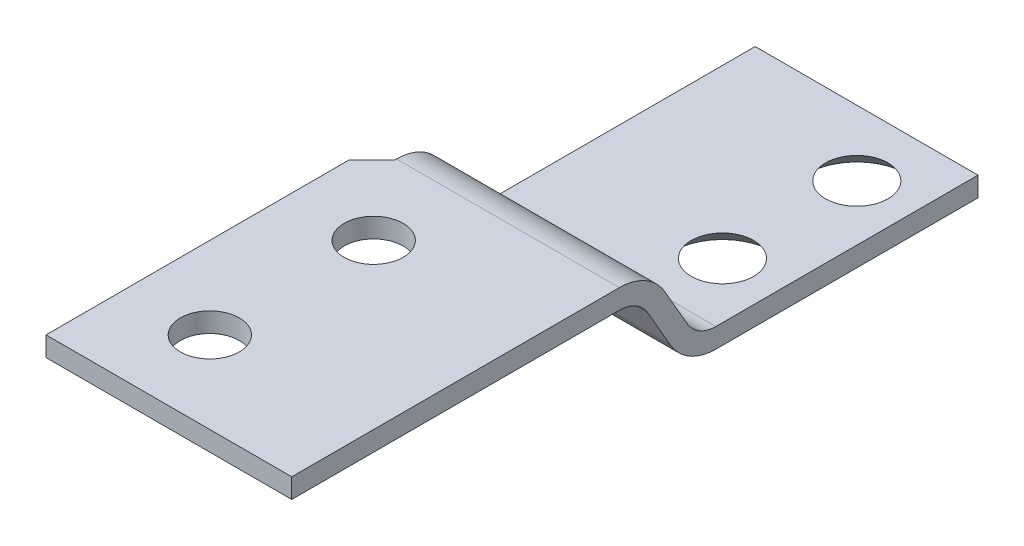
ISO-10303-21;
HEADER;
FILE_DESCRIPTION(('STEP AP214'),'2;1');
FILE_NAME('part.step','',(''),(''),'','','');
FILE_SCHEMA(('AUTOMOTIVE_DESIGN { 1 0 10303 214 1 1 1 1 }'));
ENDSEC;
DATA;
#1=APPLICATION_CONTEXT('core data for automotive mechanical design processes');
#2=APPLICATION_PROTOCOL_DEFINITION('international standard','automotive_design',2000,#1);
#3=PRODUCT_CONTEXT('',#1,'mechanical');
#4=PRODUCT('Part','Part','',(#3));
#5=PRODUCT_RELATED_PRODUCT_CATEGORY('part','',(#4));
#6=PRODUCT_DEFINITION_FORMATION('','',#4);
#7=PRODUCT_DEFINITION_CONTEXT('part definition',#1,'design');
#8=PRODUCT_DEFINITION('design','',#6,#7);
#9=PRODUCT_DEFINITION_SHAPE('','',#8);
#10=(LENGTH_UNIT() NAMED_UNIT(*) SI_UNIT(.MILLI.,.METRE.));
#11=(NAMED_UNIT(*) PLANE_ANGLE_UNIT() SI_UNIT($,.RADIAN.));
#12=(NAMED_UNIT(*) SI_UNIT($,.STERADIAN.) SOLID_ANGLE_UNIT());
#13=UNCERTAINTY_MEASURE_WITH_UNIT(LENGTH_MEASURE(1.E-05),#10,'distance_accuracy_value','');
#14=(GEOMETRIC_REPRESENTATION_CONTEXT(3) GLOBAL_UNCERTAINTY_ASSIGNED_CONTEXT((#13)) GLOBAL_UNIT_ASSIGNED_CONTEXT((#10,
#11,#12)) REPRESENTATION_CONTEXT('',''));
#15=CARTESIAN_POINT('',(0.,0.,0.));
#16=DIRECTION('',(0.,0.,1.));
#17=DIRECTION('',(1.,0.,0.));
#18=AXIS2_PLACEMENT_3D('',#15,#16,#17);
#19=CARTESIAN_POINT('',(8.6,-3.500000000031,27.28756443468));
#20=DIRECTION('',(0.,-0.49999999999819,0.866025403785483));
#21=DIRECTION('',(0.,-0.866025403785483,-0.49999999999819));
#22=AXIS2_PLACEMENT_3D('',#19,#20,#21);
#23=PLANE('',#22);
#24=DIRECTION('',(1.,0.,0.));
#25=VECTOR('',#24,1.);
#26=CARTESIAN_POINT('',(5.064,-2.90000000005065,27.6339745961863));
#27=LINE('',#26,#25);
#28=CARTESIAN_POINT('',(12.,-2.90000000002502,27.6339745961983));
#29=VERTEX_POINT('',#28);
#30=CARTESIAN_POINT('',(5.2,-2.90000000002456,27.6339745962019));
#31=VERTEX_POINT('',#30);
#32=EDGE_CURVE('E374',#29,#31,#27,.F.);
#33=ORIENTED_EDGE('',*,*,#32,.T.);
#34=DIRECTION('',(0.,-0.866025403783305,-0.500000000001964));
#35=VECTOR('',#34,1.);
#36=CARTESIAN_POINT('',(5.2,-2.900000000098,27.63397459616));
#37=LINE('',#36,#35);
#38=CARTESIAN_POINT('',(5.2,-4.10000000002244,26.9411542731723));
#39=VERTEX_POINT('',#38);
#40=EDGE_CURVE('E281',#31,#39,#37,.T.);
#41=ORIENTED_EDGE('',*,*,#40,.T.);
#42=DIRECTION('',(1.,0.,0.));
#43=VECTOR('',#42,1.);
#44=CARTESIAN_POINT('',(5.064,-4.10000000004162,26.9411542731611));
#45=LINE('',#44,#43);
#46=CARTESIAN_POINT('',(12.,-4.10000000001951,26.9411542731742));
#47=VERTEX_POINT('',#46);
#48=EDGE_CURVE('E440',#47,#39,#45,.F.);
#49=ORIENTED_EDGE('',*,*,#48,.F.);
#50=DIRECTION('',(0.,-0.866025403785483,-0.49999999999819));
#51=VECTOR('',#50,1.);
#52=CARTESIAN_POINT('',(12.,-3.500000000031,27.28756443468));
#53=LINE('',#52,#51);
#54=EDGE_CURVE('E437',#47,#29,#53,.F.);
#55=ORIENTED_EDGE('',*,*,#54,.T.);
#56=EDGE_LOOP('',(#33,#41,#49,#55));
#57=FACE_BOUND('',#56,.T.);
#58=ADVANCED_FACE('F17',(#57),#23,.T.);
#59=CARTESIAN_POINT('',(5.064,-3.3,25.55551362713));
#60=DIRECTION('',(1.,0.,0.));
#61=DIRECTION('',(0.,0.,-1.));
#62=AXIS2_PLACEMENT_3D('',#59,#60,#61);
#63=CYLINDRICAL_SURFACE('',#62,1.6);
#64=ORIENTED_EDGE('',*,*,#48,.T.);
#65=CARTESIAN_POINT('',(5.2,-3.3,25.55551362713));
#66=DIRECTION('',(1.,0.,0.));
#67=DIRECTION('',(0.,0.,-1.));
#68=AXIS2_PLACEMENT_3D('',#65,#66,#67);
#69=CIRCLE('',#68,1.6);
#70=CARTESIAN_POINT('',(5.2,-4.9,25.555513752375));
#71=VERTEX_POINT('',#70);
#72=EDGE_CURVE('E426',#39,#71,#69,.T.);
#73=ORIENTED_EDGE('',*,*,#72,.T.);
#74=DIRECTION('',(1.,0.,0.));
#75=VECTOR('',#74,1.);
#76=CARTESIAN_POINT('',(8.6,-4.9,25.55551387762));
#77=LINE('',#76,#75);
#78=CARTESIAN_POINT('',(12.,-4.9,25.555513752375));
#79=VERTEX_POINT('',#78);
#80=EDGE_CURVE('E207',#71,#79,#77,.T.);
#81=ORIENTED_EDGE('',*,*,#80,.T.);
#82=CARTESIAN_POINT('',(12.,-3.3,25.55551362713));
#83=DIRECTION('',(1.,0.,0.));
#84=DIRECTION('',(0.,0.,-1.));
#85=AXIS2_PLACEMENT_3D('',#82,#83,#84);
#86=CIRCLE('',#85,1.6);
#87=EDGE_CURVE('E20',#79,#47,#86,.F.);
#88=ORIENTED_EDGE('',*,*,#87,.T.);
#89=EDGE_LOOP('',(#64,#73,#81,#88));
#90=FACE_BOUND('',#89,.T.);
#91=ADVANCED_FACE('F308',(#90),#63,.T.);
#92=CARTESIAN_POINT('',(10.3,-4.89923208533583,19.55551362713));
#93=DIRECTION('',(0.,-1.,0.));
#94=DIRECTION('',(0.,0.,-1.));
#95=AXIS2_PLACEMENT_3D('',#92,#93,#94);
#96=CONICAL_SURFACE('',#95,1.55102813048321,0.785977484097372);
#97=CARTESIAN_POINT('',(10.3,-4.29999999994373,19.55551362713));
#98=DIRECTION('',(0.,-1.,0.));
#99=DIRECTION('',(0.,0.,-1.));
#100=AXIS2_PLACEMENT_3D('',#97,#98,#99);
#101=CIRCLE('',#100,0.951101347458422);
#102=CARTESIAN_POINT('',(9.34889865257,-4.29999999997218,19.55551362713));
#103=VERTEX_POINT('',#102);
#104=CARTESIAN_POINT('',(11.25110134743,-4.29999999997218,19.55551362713));
#105=VERTEX_POINT('',#104);
#106=EDGE_CURVE('E441',#103,#105,#101,.T.);
#107=ORIENTED_EDGE('',*,*,#106,.F.);
#108=CARTESIAN_POINT('',(9.34889865259842,-4.30000000000064,19.55551362713));
#109=CARTESIAN_POINT('',(9.32390784978886,-4.32496186415412,19.555474196763));
#110=CARTESIAN_POINT('',(9.29891705067895,-4.3499237271018,19.5554316582225));
#111=CARTESIAN_POINT('',(9.24893545854186,-4.39984745299716,19.5553403647934));
#112=CARTESIAN_POINT('',(9.22394466551468,-4.42480931594484,19.5552916099039));
#113=CARTESIAN_POINT('',(9.17396308665288,-4.4747330418282,19.5551878837777));
#114=CARTESIAN_POINT('',(9.14897230081826,-4.49969490476387,19.5551329125401));
#115=CARTESIAN_POINT('',(9.09899073756128,-4.54961863064534,19.5550167537187));
#116=CARTESIAN_POINT('',(9.07399996013891,-4.57458049359112,19.5549555661341));
#117=CARTESIAN_POINT('',(9.02401841483712,-4.62450421948269,19.5548269746199));
#118=CARTESIAN_POINT('',(8.99902764695768,-4.64946608242848,19.5547595706896));
#119=CARTESIAN_POINT('',(8.94904612187242,-4.69938980830994,19.5546185464854));
#120=CARTESIAN_POINT('',(8.92405536466659,-4.72435167124562,19.5545449262107));
#121=CARTESIAN_POINT('',(8.87407386214822,-4.77427539712898,19.5543914693196));
#122=CARTESIAN_POINT('',(8.84908311683569,-4.79923726007666,19.5543116327023));
#123=CARTESIAN_POINT('',(8.79910163921375,-4.84916098597202,19.5541457431279));
#124=CARTESIAN_POINT('',(8.77411090690435,-4.8741228489197,19.5540596901699));
#125=CARTESIAN_POINT('',(8.74912018366711,-4.89908470984801,19.55397052905));
#126=B_SPLINE_CURVE_WITH_KNOTS('',3,(#108,#109,#110,#111,#112,#113,#114,#115,#116,#117,#118,
#119,#120,#121,#122,#123,#124,#125),.UNSPECIFIED.,.F.,.F.,(4,2,2,2,2,2,2,2,4),(0.,
0.105965692313845,0.211931395817098,0.317897111410708,0.423862839834758,0.529828581949982,
0.635794338617112,0.74176011057623,0.847725898728284),.UNSPECIFIED.);
#127=CARTESIAN_POINT('',(8.74898623931821,-4.89959765902095,19.5539703960443));
#128=VERTEX_POINT('',#127);
#129=EDGE_CURVE('E266',#103,#128,#126,.T.);
#130=ORIENTED_EDGE('',*,*,#129,.T.);
#131=CARTESIAN_POINT('',(10.3,-4.9,19.55551362713));
#132=DIRECTION('',(0.,1.,0.));
#133=DIRECTION('',(0.,0.,1.));
#134=AXIS2_PLACEMENT_3D('',#131,#132,#133);
#135=CIRCLE('',#134,1.55179693540095);
#136=CARTESIAN_POINT('',(11.8510273628199,-4.8996160427626,19.55705687063));
#137=VERTEX_POINT('',#136);
#138=EDGE_CURVE('E462',#128,#137,#135,.F.);
#139=ORIENTED_EDGE('',*,*,#138,.T.);
#140=CARTESIAN_POINT('',(11.8510273627909,-4.8992320855632,19.55705687063));
#141=CARTESIAN_POINT('',(11.8260304918425,-4.87426408400191,19.5569676973562));
#142=CARTESIAN_POINT('',(11.8010336118093,-4.84929608043243,19.5568816330063));
#143=CARTESIAN_POINT('',(11.7510398386431,-4.79936007321767,19.5567157221718));
#144=CARTESIAN_POINT('',(11.7260429455101,-4.77439206957239,19.5566358756863));
#145=CARTESIAN_POINT('',(11.6760491474097,-4.72445606234681,19.5564824005823));
#146=CARTESIAN_POINT('',(11.6510522424424,-4.6994880587665,19.5564087719629));
#147=CARTESIAN_POINT('',(11.6010584218077,-4.64955205158298,19.556267732593));
#148=CARTESIAN_POINT('',(11.5760615061403,-4.62458404797977,19.5562003218417));
#149=CARTESIAN_POINT('',(11.5260676652916,-4.57464804076205,19.5560717182092));
#150=CARTESIAN_POINT('',(11.5010707401104,-4.54968003714753,19.5560105253273));
#151=CARTESIAN_POINT('',(11.4510768813432,-4.49974402997713,19.5558943574348));
#152=CARTESIAN_POINT('',(11.4260799477572,-4.47477602642124,19.5558393824235));
#153=CARTESIAN_POINT('',(11.376086073338,-4.42484001923793,19.5557356502735));
#154=CARTESIAN_POINT('',(11.3510891325047,-4.39987201561051,19.5556868931341));
#155=CARTESIAN_POINT('',(11.301095244812,-4.34993600839357,19.5555955967285));
#156=CARTESIAN_POINT('',(11.2760982979526,-4.32496800480405,19.5555530574618));
#157=CARTESIAN_POINT('',(11.2511013474016,-4.30000000000064,19.55551362713));
#158=B_SPLINE_CURVE_WITH_KNOTS('',3,(#140,#141,#142,#143,#144,#145,#146,#147,#148,#149,#150,
#151,#152,#153,#154,#155,#156,#157),.UNSPECIFIED.,.F.,.F.,(4,2,2,2,2,2,2,2,4),(0.,
0.10599185567968,0.21198369552681,0.317975519839605,0.423967329679897,0.529959125788018,
0.635950908944554,0.741942680251518,0.847934440167896),.UNSPECIFIED.);
#159=EDGE_CURVE('E262',#137,#105,#158,.T.);
#160=ORIENTED_EDGE('',*,*,#159,.T.);
#161=EDGE_LOOP('',(#107,#130,#139,#160));
#162=FACE_BOUND('',#161,.T.);
#163=ADVANCED_FACE('F306',(#162),#96,.F.);
#164=CARTESIAN_POINT('',(10.3,-4.902827477963,23.65551362713));
#165=DIRECTION('',(0.,-1.,0.));
#166=DIRECTION('',(0.,0.,-1.));
#167=AXIS2_PLACEMENT_3D('',#164,#165,#166);
#168=CONICAL_SURFACE('',#167,1.55462769121692,0.785977484073824);
#169=CARTESIAN_POINT('',(10.3,-4.30000000000064,23.65551362713));
#170=DIRECTION('',(0.,-1.,0.));
#171=DIRECTION('',(0.,0.,-1.));
#172=AXIS2_PLACEMENT_3D('',#169,#170,#171);
#173=CIRCLE('',#172,0.951101347464425);
#174=CARTESIAN_POINT('',(9.34889865253558,-4.30000000000064,23.65551362713));
#175=VERTEX_POINT('',#174);
#176=CARTESIAN_POINT('',(11.2511013474644,-4.30000000000064,23.65551362713));
#177=VERTEX_POINT('',#176);
#178=EDGE_CURVE('E430',#175,#177,#173,.T.);
#179=ORIENTED_EDGE('',*,*,#178,.F.);
#180=CARTESIAN_POINT('',(9.34889865253558,-4.30000000000064,23.65551362713));
#181=CARTESIAN_POINT('',(9.32390784994841,-4.32496186393063,23.6554772097434));
#182=CARTESIAN_POINT('',(9.29891705052104,-4.34992372683599,23.6554379216874));
#183=CARTESIAN_POINT('',(9.24893545678193,-4.39984745272251,23.6553536042348));
#184=CARTESIAN_POINT('',(9.2239446624702,-4.42480931570366,23.6553085748376));
#185=CARTESIAN_POINT('',(9.17396308005154,-4.47473304157639,23.6552127747032));
#186=CARTESIAN_POINT('',(9.14897229194461,-4.49969490446795,23.6551620039655));
#187=CARTESIAN_POINT('',(9.09899072287992,-4.54961863030612,23.655054721151));
#188=CARTESIAN_POINT('',(9.07399994192216,-4.57458049325272,23.6549982090737));
#189=CARTESIAN_POINT('',(9.02401838811118,-4.62450421912914,23.6548794435812));
#190=CARTESIAN_POINT('',(8.99902761525795,-4.64946608205897,23.6548171901653));
#191=CARTESIAN_POINT('',(8.949046078712,-4.69938980793066,23.6546869419967));
#192=CARTESIAN_POINT('',(8.92405531501927,-4.72435167087254,23.6546189472433));
#193=CARTESIAN_POINT('',(8.87407379774955,-4.77427539675328,23.6544772164012));
#194=CARTESIAN_POINT('',(8.84908304417256,-4.79923725969214,23.6544034803117));
#195=CARTESIAN_POINT('',(8.79910154810765,-4.84916098556987,23.6542502667988));
#196=CARTESIAN_POINT('',(8.77411080561973,-4.87412284850873,23.6541707893747));
#197=CARTESIAN_POINT('',(8.74912007087975,-4.89908470973432,23.65408844129));
#198=B_SPLINE_CURVE_WITH_KNOTS('',3,(#180,#181,#182,#183,#184,#185,#186,#187,#188,#189,#190,
#191,#192,#193,#194,#195,#196,#197),.UNSPECIFIED.,.F.,.F.,(4,2,2,2,2,2,2,2,4),(0.,
0.105965681683277,0.211931373226913,0.317897074768146,0.423862787408787,0.529828511768402,
0.635794248466468,0.741759998243115,0.84772576183847),.UNSPECIFIED.);
#199=CARTESIAN_POINT('',(8.74898612650636,-4.89959765897933,23.6540883184476));
#200=VERTEX_POINT('',#199);
#201=EDGE_CURVE('E230',#175,#200,#198,.T.);
#202=ORIENTED_EDGE('',*,*,#201,.T.);
#203=CARTESIAN_POINT('',(10.3,-4.9,23.65551362713));
#204=DIRECTION('',(0.,1.,0.));
#205=DIRECTION('',(0.,0.,1.));
#206=AXIS2_PLACEMENT_3D('',#203,#204,#205);
#207=CIRCLE('',#206,1.55179693532168);
#208=CARTESIAN_POINT('',(11.8510903166239,-4.89961604134154,23.6570569866901));
#209=VERTEX_POINT('',#208);
#210=EDGE_CURVE('E201',#200,#209,#207,.F.);
#211=ORIENTED_EDGE('',*,*,#210,.T.);
#212=CARTESIAN_POINT('',(11.8510273628006,-4.89923208550636,23.6570569240501));
#213=CARTESIAN_POINT('',(11.8260304918394,-4.87426408388759,23.6569677476897));
#214=CARTESIAN_POINT('',(11.8010336117657,-4.84929608028769,23.6568816803606));
#215=CARTESIAN_POINT('',(11.7510398385932,-4.79936007310682,23.6567157637829));
#216=CARTESIAN_POINT('',(11.7260429454945,-4.77439206952587,23.6566359145334));
#217=CARTESIAN_POINT('',(11.6760491474404,-4.72445606233679,23.6564824341168));
#218=CARTESIAN_POINT('',(11.651052242485,-4.69948805872866,23.6564088029488));
#219=CARTESIAN_POINT('',(11.601058421865,-4.64955205151684,23.6562677586968));
#220=CARTESIAN_POINT('',(11.5760615062004,-4.62458404791314,23.656200345612));
#221=CARTESIAN_POINT('',(11.5260676653265,-4.57464804070574,23.6560717375278));
#222=CARTESIAN_POINT('',(11.5010707401172,-4.54968003710202,23.6560105425277));
#223=CARTESIAN_POINT('',(11.4510768813562,-4.49974402992811,23.655894370614));
#224=CARTESIAN_POINT('',(11.4260799478046,-4.47477602635791,23.6558393936997));
#225=CARTESIAN_POINT('',(11.3760860733928,-4.42484001916883,23.6557356579589));
#226=CARTESIAN_POINT('',(11.3510891325326,-4.39987201554995,23.6556868991318));
#227=CARTESIAN_POINT('',(11.3010952448236,-4.34993600836904,23.655595599566));
#228=CARTESIAN_POINT('',(11.2760982979748,-4.32496800480701,23.6555530588267));
#229=CARTESIAN_POINT('',(11.2511013474644,-4.30000000000064,23.65551362713));
#230=B_SPLINE_CURVE_WITH_KNOTS('',3,(#212,#213,#214,#215,#216,#217,#218,#219,#220,#221,#222,
#223,#224,#225,#226,#227,#228,#229),.UNSPECIFIED.,.F.,.F.,(4,2,2,2,2,2,2,2,4),(0.,
0.105991855852022,0.211983695508652,0.317975519871003,0.423967329719677,0.529959125875447,
0.635950908998308,0.741942680351196,0.847934440192118),.UNSPECIFIED.);
#231=EDGE_CURVE('E248',#209,#177,#230,.T.);
#232=ORIENTED_EDGE('',*,*,#231,.T.);
#233=EDGE_LOOP('',(#179,#202,#211,#232));
#234=FACE_BOUND('',#233,.T.);
#235=ADVANCED_FACE('F303',(#234),#168,.F.);
#236=CARTESIAN_POINT('',(8.6,-4.6,17.55551362713));
#237=DIRECTION('',(0.,0.,1.));
#238=DIRECTION('',(1.,0.,0.));
#239=AXIS2_PLACEMENT_3D('',#236,#237,#238);
#240=PLANE('',#239);
#241=DIRECTION('',(0.,1.,0.));
#242=VECTOR('',#241,1.);
#243=CARTESIAN_POINT('',(12.,-4.6,17.55551362713));
#244=LINE('',#243,#242);
#245=CARTESIAN_POINT('',(12.,-4.9,17.55551362713));
#246=VERTEX_POINT('',#245);
#247=CARTESIAN_POINT('',(12.,-4.3,17.55551362713));
#248=VERTEX_POINT('',#247);
#249=EDGE_CURVE('E114',#246,#248,#244,.T.);
#250=ORIENTED_EDGE('',*,*,#249,.F.);
#251=DIRECTION('',(1.,0.,0.));
#252=VECTOR('',#251,1.);
#253=CARTESIAN_POINT('',(8.6,-4.9,17.55551362713));
#254=LINE('',#253,#252);
#255=CARTESIAN_POINT('',(5.2,-4.9,17.55551362713));
#256=VERTEX_POINT('',#255);
#257=EDGE_CURVE('E209',#246,#256,#254,.F.);
#258=ORIENTED_EDGE('',*,*,#257,.T.);
#259=DIRECTION('',(0.,1.,0.));
#260=VECTOR('',#259,1.);
#261=CARTESIAN_POINT('',(5.2,-3.35,17.55551362713));
#262=LINE('',#261,#260);
#263=CARTESIAN_POINT('',(5.2,-4.3,17.55551362713));
#264=VERTEX_POINT('',#263);
#265=EDGE_CURVE('E272',#256,#264,#262,.T.);
#266=ORIENTED_EDGE('',*,*,#265,.T.);
#267=DIRECTION('',(1.,0.,0.));
#268=VECTOR('',#267,1.);
#269=CARTESIAN_POINT('',(8.6,-4.3,17.55551362713));
#270=LINE('',#269,#268);
#271=EDGE_CURVE('E200',#248,#264,#270,.F.);
#272=ORIENTED_EDGE('',*,*,#271,.F.);
#273=EDGE_LOOP('',(#250,#258,#266,#272));
#274=FACE_BOUND('',#273,.T.);
#275=ADVANCED_FACE('F299',(#274),#240,.F.);
#276=CARTESIAN_POINT('',(5.2,-3.35,23.05551362713));
#277=DIRECTION('',(1.,0.,0.));
#278=DIRECTION('',(0.,0.,-1.));
#279=AXIS2_PLACEMENT_3D('',#276,#277,#278);
#280=PLANE('',#279);
#281=DIRECTION('',(0.,0.,1.));
#282=VECTOR('',#281,1.);
#283=CARTESIAN_POINT('',(5.2,-4.3,21.55551362713));
#284=LINE('',#283,#282);
#285=CARTESIAN_POINT('',(5.2,-4.3,25.55551362713));
#286=VERTEX_POINT('',#285);
#287=EDGE_CURVE('E204',#264,#286,#284,.T.);
#288=ORIENTED_EDGE('',*,*,#287,.F.);
#289=ORIENTED_EDGE('',*,*,#265,.F.);
#290=DIRECTION('',(0.,0.,1.));
#291=VECTOR('',#290,1.);
#292=CARTESIAN_POINT('',(5.2,-4.9,21.55551369671));
#293=LINE('',#292,#291);
#294=EDGE_CURVE('E210',#256,#71,#293,.T.);
#295=ORIENTED_EDGE('',*,*,#294,.T.);
#296=ORIENTED_EDGE('',*,*,#72,.F.);
#297=ORIENTED_EDGE('',*,*,#40,.F.);
#298=CARTESIAN_POINT('',(5.2,-3.4,28.5));
#299=DIRECTION('',(1.,0.,0.));
#300=DIRECTION('',(0.,0.,-1.));
#301=AXIS2_PLACEMENT_3D('',#298,#299,#300);
#302=CIRCLE('',#301,1.);
#303=CARTESIAN_POINT('',(5.2,-2.4,28.5));
#304=VERTEX_POINT('',#303);
#305=EDGE_CURVE('E377',#31,#304,#302,.T.);
#306=ORIENTED_EDGE('',*,*,#305,.T.);
#307=DIRECTION('',(0.,0.,-1.));
#308=VECTOR('',#307,1.);
#309=CARTESIAN_POINT('',(5.2,-2.4,23.05551362713));
#310=LINE('',#309,#308);
#311=CARTESIAN_POINT('',(5.19999999999953,-2.4,28.5555136271295));
#312=VERTEX_POINT('',#311);
#313=EDGE_CURVE('E383',#312,#304,#310,.T.);
#314=ORIENTED_EDGE('',*,*,#313,.F.);
#315=DIRECTION('',(0.,1.,0.));
#316=VECTOR('',#315,1.);
#317=CARTESIAN_POINT('',(5.2,-3.35,28.55551362713));
#318=LINE('',#317,#316);
#319=CARTESIAN_POINT('',(5.2,-1.8,28.55551362713));
#320=VERTEX_POINT('',#319);
#321=EDGE_CURVE('E409',#320,#312,#318,.F.);
#322=ORIENTED_EDGE('',*,*,#321,.F.);
#323=DIRECTION('',(0.,0.,-1.));
#324=VECTOR('',#323,1.);
#325=CARTESIAN_POINT('',(5.2,-1.8,23.05551362713));
#326=LINE('',#325,#324);
#327=CARTESIAN_POINT('',(5.2,-1.8,28.499999944205));
#328=VERTEX_POINT('',#327);
#329=EDGE_CURVE('E404',#328,#320,#326,.F.);
#330=ORIENTED_EDGE('',*,*,#329,.F.);
#331=CARTESIAN_POINT('',(5.2,-3.4,28.5));
#332=DIRECTION('',(1.,0.,0.));
#333=DIRECTION('',(0.,0.,-1.));
#334=AXIS2_PLACEMENT_3D('',#331,#332,#333);
#335=CIRCLE('',#334,1.6);
#336=CARTESIAN_POINT('',(5.2,-2.60000000000702,27.1143593539418));
#337=VERTEX_POINT('',#336);
#338=EDGE_CURVE('E408',#337,#328,#335,.T.);
#339=ORIENTED_EDGE('',*,*,#338,.F.);
#340=DIRECTION('',(0.,0.866025403781748,0.500000000004661));
#341=VECTOR('',#340,1.);
#342=CARTESIAN_POINT('',(5.2,-3.800000000001,26.42153903091));
#343=LINE('',#342,#341);
#344=CARTESIAN_POINT('',(5.2,-3.8000000000018,26.4215390309091));
#345=VERTEX_POINT('',#344);
#346=EDGE_CURVE('E412',#345,#337,#343,.T.);
#347=ORIENTED_EDGE('',*,*,#346,.F.);
#348=CARTESIAN_POINT('',(5.2,-3.3,25.55551362713));
#349=DIRECTION('',(1.,0.,0.));
#350=DIRECTION('',(0.,0.,-1.));
#351=AXIS2_PLACEMENT_3D('',#348,#349,#350);
#352=CIRCLE('',#351,1.);
#353=EDGE_CURVE('E255',#345,#286,#352,.T.);
#354=ORIENTED_EDGE('',*,*,#353,.T.);
#355=EDGE_LOOP('',(#288,#289,#295,#296,#297,#306,#314,#322,#330,#339,#347,#354));
#356=FACE_BOUND('',#355,.T.);
#357=ADVANCED_FACE('F295',(#356),#280,.F.);
#358=CARTESIAN_POINT('',(10.3,-4.89923208539267,19.55551362713));
#359=DIRECTION('',(0.,-1.,0.));
#360=DIRECTION('',(0.,0.,-1.));
#361=AXIS2_PLACEMENT_3D('',#358,#359,#360);
#362=CONICAL_SURFACE('',#361,1.55102813036952,0.785977484049996);
#363=ORIENTED_EDGE('',*,*,#159,.F.);
#364=CARTESIAN_POINT('',(10.3,-4.9,19.55551362713));
#365=DIRECTION('',(0.,1.,0.));
#366=DIRECTION('',(0.,0.,1.));
#367=AXIS2_PLACEMENT_3D('',#364,#365,#366);
#368=CIRCLE('',#367,1.55179693523028);
#369=EDGE_CURVE('E212',#137,#128,#368,.F.);
#370=ORIENTED_EDGE('',*,*,#369,.T.);
#371=ORIENTED_EDGE('',*,*,#129,.F.);
#372=CARTESIAN_POINT('',(10.3,-4.30000000000057,19.55551362713));
#373=DIRECTION('',(0.,-1.,0.));
#374=DIRECTION('',(0.,0.,-1.));
#375=AXIS2_PLACEMENT_3D('',#372,#373,#374);
#376=CIRCLE('',#375,0.951101347401579);
#377=EDGE_CURVE('E422',#105,#103,#376,.T.);
#378=ORIENTED_EDGE('',*,*,#377,.F.);
#379=EDGE_LOOP('',(#363,#370,#371,#378));
#380=FACE_BOUND('',#379,.T.);
#381=ADVANCED_FACE('F290',(#380),#362,.F.);
#382=CARTESIAN_POINT('',(10.3,-4.89923208550636,23.65551362713));
#383=DIRECTION('',(0.,-1.,0.));
#384=DIRECTION('',(0.,0.,-1.));
#385=AXIS2_PLACEMENT_3D('',#382,#383,#384);
#386=CONICAL_SURFACE('',#385,1.5510281306029,0.785977484097317);
#387=ORIENTED_EDGE('',*,*,#231,.F.);
#388=CARTESIAN_POINT('',(10.3,-4.9,23.65551362713));
#389=DIRECTION('',(0.,1.,0.));
#390=DIRECTION('',(0.,0.,1.));
#391=AXIS2_PLACEMENT_3D('',#388,#389,#390);
#392=CIRCLE('',#391,1.55179693534991);
#393=EDGE_CURVE('E458',#209,#200,#392,.F.);
#394=ORIENTED_EDGE('',*,*,#393,.T.);
#395=ORIENTED_EDGE('',*,*,#201,.F.);
#396=CARTESIAN_POINT('',(10.3,-4.30000000000064,23.65551362713));
#397=DIRECTION('',(0.,-1.,0.));
#398=DIRECTION('',(0.,0.,-1.));
#399=AXIS2_PLACEMENT_3D('',#396,#397,#398);
#400=CIRCLE('',#399,0.951101347464425);
#401=EDGE_CURVE('E196',#177,#175,#400,.T.);
#402=ORIENTED_EDGE('',*,*,#401,.F.);
#403=EDGE_LOOP('',(#387,#394,#395,#402));
#404=FACE_BOUND('',#403,.T.);
#405=ADVANCED_FACE('F238',(#404),#386,.F.);
#406=CARTESIAN_POINT('',(5.064,-3.3,25.55551362713));
#407=DIRECTION('',(1.,0.,0.));
#408=DIRECTION('',(0.,0.,-1.));
#409=AXIS2_PLACEMENT_3D('',#406,#407,#408);
#410=CYLINDRICAL_SURFACE('',#409,1.);
#411=CARTESIAN_POINT('',(12.,-3.3,25.55551362713));
#412=DIRECTION('',(1.,0.,0.));
#413=DIRECTION('',(0.,0.,-1.));
#414=AXIS2_PLACEMENT_3D('',#411,#412,#413);
#415=CIRCLE('',#414,1.);
#416=CARTESIAN_POINT('',(12.,-4.3,25.55551362713));
#417=VERTEX_POINT('',#416);
#418=CARTESIAN_POINT('',(12.,-3.80000000000012,26.4215390309112));
#419=VERTEX_POINT('',#418);
#420=EDGE_CURVE('E259',#417,#419,#415,.F.);
#421=ORIENTED_EDGE('',*,*,#420,.F.);
#422=DIRECTION('',(1.,0.,0.));
#423=VECTOR('',#422,1.);
#424=CARTESIAN_POINT('',(8.6,-4.3,25.55551362713));
#425=LINE('',#424,#423);
#426=EDGE_CURVE('E197',#286,#417,#425,.T.);
#427=ORIENTED_EDGE('',*,*,#426,.F.);
#428=ORIENTED_EDGE('',*,*,#353,.F.);
#429=DIRECTION('',(1.,0.,0.));
#430=VECTOR('',#429,1.);
#431=CARTESIAN_POINT('',(8.6,-3.80000000000062,26.4215390309093));
#432=LINE('',#431,#430);
#433=EDGE_CURVE('E192',#345,#419,#432,.T.);
#434=ORIENTED_EDGE('',*,*,#433,.T.);
#435=EDGE_LOOP('',(#421,#427,#428,#434));
#436=FACE_BOUND('',#435,.T.);
#437=ADVANCED_FACE('F236',(#436),#410,.F.);
#438=CARTESIAN_POINT('',(5.064,-3.4,28.5));
#439=DIRECTION('',(1.,0.,0.));
#440=DIRECTION('',(0.,0.,-1.));
#441=AXIS2_PLACEMENT_3D('',#438,#439,#440);
#442=CYLINDRICAL_SURFACE('',#441,1.);
#443=CARTESIAN_POINT('',(12.,-3.4,28.5));
#444=DIRECTION('',(1.,0.,0.));
#445=DIRECTION('',(0.,0.,-1.));
#446=AXIS2_PLACEMENT_3D('',#443,#444,#445);
#447=CIRCLE('',#446,1.);
#448=CARTESIAN_POINT('',(12.,-2.4,28.5));
#449=VERTEX_POINT('',#448);
#450=EDGE_CURVE('E370',#449,#29,#447,.F.);
#451=ORIENTED_EDGE('',*,*,#450,.F.);
#452=DIRECTION('',(1.,0.,0.));
#453=VECTOR('',#452,1.);
#454=CARTESIAN_POINT('',(8.25,-2.4,28.5));
#455=LINE('',#454,#453);
#456=EDGE_CURVE('E195',#449,#304,#455,.F.);
#457=ORIENTED_EDGE('',*,*,#456,.T.);
#458=ORIENTED_EDGE('',*,*,#305,.F.);
#459=ORIENTED_EDGE('',*,*,#32,.F.);
#460=EDGE_LOOP('',(#451,#457,#458,#459));
#461=FACE_BOUND('',#460,.T.);
#462=ADVANCED_FACE('F361',(#461),#442,.F.);
#463=CARTESIAN_POINT('',(8.6,-4.9,21.55551369671));
#464=DIRECTION('',(0.,1.,0.));
#465=DIRECTION('',(0.,0.,1.));
#466=AXIS2_PLACEMENT_3D('',#463,#464,#465);
#467=PLANE('',#466);
#468=ORIENTED_EDGE('',*,*,#210,.F.);
#469=ORIENTED_EDGE('',*,*,#393,.F.);
#470=EDGE_LOOP('',(#468,#469));
#471=FACE_BOUND('',#470,.T.);
#472=ORIENTED_EDGE('',*,*,#138,.F.);
#473=ORIENTED_EDGE('',*,*,#369,.F.);
#474=EDGE_LOOP('',(#472,#473));
#475=FACE_BOUND('',#474,.T.);
#476=DIRECTION('',(0.,0.,-1.));
#477=VECTOR('',#476,1.);
#478=CARTESIAN_POINT('',(12.,-4.9,28.02775681356));
#479=LINE('',#478,#477);
#480=EDGE_CURVE('E385',#79,#246,#479,.T.);
#481=ORIENTED_EDGE('',*,*,#480,.F.);
#482=ORIENTED_EDGE('',*,*,#80,.F.);
#483=ORIENTED_EDGE('',*,*,#294,.F.);
#484=ORIENTED_EDGE('',*,*,#257,.F.);
#485=EDGE_LOOP('',(#481,#482,#483,#484));
#486=FACE_BOUND('',#485,.T.);
#487=ADVANCED_FACE('F358',(#471,#475,#486),#467,.F.);
#488=CARTESIAN_POINT('',(8.6,-4.3,21.55551362713));
#489=DIRECTION('',(0.,1.,0.));
#490=DIRECTION('',(0.,0.,1.));
#491=AXIS2_PLACEMENT_3D('',#488,#489,#490);
#492=PLANE('',#491);
#493=ORIENTED_EDGE('',*,*,#178,.T.);
#494=ORIENTED_EDGE('',*,*,#401,.T.);
#495=EDGE_LOOP('',(#493,#494));
#496=FACE_BOUND('',#495,.T.);
#497=ORIENTED_EDGE('',*,*,#106,.T.);
#498=ORIENTED_EDGE('',*,*,#377,.T.);
#499=EDGE_LOOP('',(#497,#498));
#500=FACE_BOUND('',#499,.T.);
#501=ORIENTED_EDGE('',*,*,#271,.T.);
#502=ORIENTED_EDGE('',*,*,#287,.T.);
#503=ORIENTED_EDGE('',*,*,#426,.T.);
#504=DIRECTION('',(0.,0.,-1.));
#505=VECTOR('',#504,1.);
#506=CARTESIAN_POINT('',(12.,-4.3,28.02775681356));
#507=LINE('',#506,#505);
#508=EDGE_CURVE('E387',#248,#417,#507,.F.);
#509=ORIENTED_EDGE('',*,*,#508,.F.);
#510=EDGE_LOOP('',(#501,#502,#503,#509));
#511=FACE_BOUND('',#510,.T.);
#512=ADVANCED_FACE('F354',(#496,#500,#511),#492,.T.);
#513=CARTESIAN_POINT('',(8.6,-3.200000000011,26.76794919242));
#514=DIRECTION('',(0.,-0.500000000003121,0.866025403782637));
#515=DIRECTION('',(0.,-0.866025403782637,-0.500000000003121));
#516=AXIS2_PLACEMENT_3D('',#513,#514,#515);
#517=PLANE('',#516);
#518=DIRECTION('',(0.,0.866025403784274,0.500000000000286));
#519=VECTOR('',#518,1.);
#520=CARTESIAN_POINT('',(12.,-3.800000000005,26.42153903091));
#521=LINE('',#520,#519);
#522=CARTESIAN_POINT('',(12.,-2.60000000000927,27.1143593539376));
#523=VERTEX_POINT('',#522);
#524=EDGE_CURVE('E452',#419,#523,#521,.T.);
#525=ORIENTED_EDGE('',*,*,#524,.F.);
#526=ORIENTED_EDGE('',*,*,#433,.F.);
#527=ORIENTED_EDGE('',*,*,#346,.T.);
#528=DIRECTION('',(1.,0.,0.));
#529=VECTOR('',#528,1.);
#530=CARTESIAN_POINT('',(5.064,-2.6000000000207,27.1143593539329));
#531=LINE('',#530,#529);
#532=EDGE_CURVE('E188',#523,#337,#531,.F.);
#533=ORIENTED_EDGE('',*,*,#532,.F.);
#534=EDGE_LOOP('',(#525,#526,#527,#533));
#535=FACE_BOUND('',#534,.T.);
#536=ADVANCED_FACE('F350',(#535),#517,.F.);
#537=CARTESIAN_POINT('',(8.25,-2.4,33.5));
#538=DIRECTION('',(0.,1.,0.));
#539=DIRECTION('',(0.,0.,1.));
#540=AXIS2_PLACEMENT_3D('',#537,#538,#539);
#541=PLANE('',#540);
#542=CARTESIAN_POINT('',(7.,-2.4,31.));
#543=DIRECTION('',(0.,-1.,0.));
#544=DIRECTION('',(0.,0.,-1.));
#545=AXIS2_PLACEMENT_3D('',#542,#543,#544);
#546=CIRCLE('',#545,0.9);
#547=CARTESIAN_POINT('',(7.,-2.4,30.1));
#548=VERTEX_POINT('',#547);
#549=EDGE_CURVE('E175',#548,#548,#546,.F.);
#550=ORIENTED_EDGE('',*,*,#549,.T.);
#551=EDGE_LOOP('',(#550));
#552=FACE_BOUND('',#551,.T.);
#553=CARTESIAN_POINT('',(7.,-2.4,36.));
#554=DIRECTION('',(0.,-1.,0.));
#555=DIRECTION('',(0.,0.,-1.));
#556=AXIS2_PLACEMENT_3D('',#553,#554,#555);
#557=CIRCLE('',#556,0.9);
#558=CARTESIAN_POINT('',(7.,-2.4,35.1));
#559=VERTEX_POINT('',#558);
#560=EDGE_CURVE('E191',#559,#559,#557,.F.);
#561=ORIENTED_EDGE('',*,*,#560,.T.);
#562=EDGE_LOOP('',(#561));
#563=FACE_BOUND('',#562,.T.);
#564=DIRECTION('',(0.,0.,-1.));
#565=VECTOR('',#564,1.);
#566=CARTESIAN_POINT('',(12.,-2.4,28.02775681356));
#567=LINE('',#566,#565);
#568=CARTESIAN_POINT('',(12.,-2.4,38.5));
#569=VERTEX_POINT('',#568);
#570=EDGE_CURVE('E381',#569,#449,#567,.T.);
#571=ORIENTED_EDGE('',*,*,#570,.F.);
#572=DIRECTION('',(1.,0.,0.));
#573=VECTOR('',#572,1.);
#574=CARTESIAN_POINT('',(8.25,-2.4,38.5));
#575=LINE('',#574,#573);
#576=CARTESIAN_POINT('',(4.5,-2.4,38.5));
#577=VERTEX_POINT('',#576);
#578=EDGE_CURVE('E160',#577,#569,#575,.T.);
#579=ORIENTED_EDGE('',*,*,#578,.F.);
#580=DIRECTION('',(0.,0.,-1.));
#581=VECTOR('',#580,1.);
#582=CARTESIAN_POINT('',(4.5,-2.4,33.87775681357));
#583=LINE('',#582,#581);
#584=CARTESIAN_POINT('',(4.50000000000047,-2.4,29.2555136271305));
#585=VERTEX_POINT('',#584);
#586=EDGE_CURVE('E157',#577,#585,#583,.T.);
#587=ORIENTED_EDGE('',*,*,#586,.T.);
#588=DIRECTION('',(0.707106781183698,0.,-0.707106781189398));
#589=VECTOR('',#588,1.);
#590=CARTESIAN_POINT('',(4.85,-2.4,28.90551362713));
#591=LINE('',#590,#589);
#592=EDGE_CURVE('E217',#585,#312,#591,.T.);
#593=ORIENTED_EDGE('',*,*,#592,.T.);
#594=ORIENTED_EDGE('',*,*,#313,.T.);
#595=ORIENTED_EDGE('',*,*,#456,.F.);
#596=EDGE_LOOP('',(#571,#579,#587,#593,#594,#595));
#597=FACE_BOUND('',#596,.T.);
#598=ADVANCED_FACE('F346',(#552,#563,#597),#541,.F.);
#599=CARTESIAN_POINT('',(4.85,-2.1,28.90551362713));
#600=DIRECTION('',(0.707106781189398,0.,0.707106781183698));
#601=DIRECTION('',(0.707106781183698,0.,-0.707106781189398));
#602=AXIS2_PLACEMENT_3D('',#599,#600,#601);
#603=PLANE('',#602);
#604=ORIENTED_EDGE('',*,*,#592,.F.);
#605=DIRECTION('',(0.,1.,0.));
#606=VECTOR('',#605,1.);
#607=CARTESIAN_POINT('',(4.5,-2.1,29.25551362713));
#608=LINE('',#607,#606);
#609=CARTESIAN_POINT('',(4.5,-1.8,29.25551362713));
#610=VERTEX_POINT('',#609);
#611=EDGE_CURVE('E182',#585,#610,#608,.T.);
#612=ORIENTED_EDGE('',*,*,#611,.T.);
#613=DIRECTION('',(-0.707106781186548,0.,0.707106781186547));
#614=VECTOR('',#613,1.);
#615=CARTESIAN_POINT('',(5.2,-1.8,28.55551362713));
#616=LINE('',#615,#614);
#617=EDGE_CURVE('E173',#320,#610,#616,.T.);
#618=ORIENTED_EDGE('',*,*,#617,.F.);
#619=ORIENTED_EDGE('',*,*,#321,.T.);
#620=EDGE_LOOP('',(#604,#612,#618,#619));
#621=FACE_BOUND('',#620,.T.);
#622=ADVANCED_FACE('F343',(#621),#603,.F.);
#623=CARTESIAN_POINT('',(4.5,-2.1,33.87775681357));
#624=DIRECTION('',(1.,0.,0.));
#625=DIRECTION('',(0.,0.,-1.));
#626=AXIS2_PLACEMENT_3D('',#623,#624,#625);
#627=PLANE('',#626);
#628=ORIENTED_EDGE('',*,*,#586,.F.);
#629=DIRECTION('',(0.,1.,0.));
#630=VECTOR('',#629,1.);
#631=CARTESIAN_POINT('',(4.5,-2.1,38.5));
#632=LINE('',#631,#630);
#633=CARTESIAN_POINT('',(4.5,-1.8,38.5));
#634=VERTEX_POINT('',#633);
#635=EDGE_CURVE('E150',#634,#577,#632,.F.);
#636=ORIENTED_EDGE('',*,*,#635,.F.);
#637=DIRECTION('',(0.,0.,1.));
#638=VECTOR('',#637,1.);
#639=CARTESIAN_POINT('',(4.5,-1.8,33.49999994421));
#640=LINE('',#639,#638);
#641=EDGE_CURVE('E155',#610,#634,#640,.T.);
#642=ORIENTED_EDGE('',*,*,#641,.F.);
#643=ORIENTED_EDGE('',*,*,#611,.F.);
#644=EDGE_LOOP('',(#628,#636,#642,#643));
#645=FACE_BOUND('',#644,.T.);
#646=ADVANCED_FACE('F152',(#645),#627,.F.);
#647=CARTESIAN_POINT('',(8.25,-2.1,38.5));
#648=DIRECTION('',(0.,0.,1.));
#649=DIRECTION('',(1.,0.,0.));
#650=AXIS2_PLACEMENT_3D('',#647,#648,#649);
#651=PLANE('',#650);
#652=DIRECTION('',(1.,0.,0.));
#653=VECTOR('',#652,1.);
#654=CARTESIAN_POINT('',(8.25,-1.8,38.5));
#655=LINE('',#654,#653);
#656=CARTESIAN_POINT('',(12.,-1.8,38.5));
#657=VERTEX_POINT('',#656);
#658=EDGE_CURVE('E163',#634,#657,#655,.T.);
#659=ORIENTED_EDGE('',*,*,#658,.F.);
#660=ORIENTED_EDGE('',*,*,#635,.T.);
#661=ORIENTED_EDGE('',*,*,#578,.T.);
#662=DIRECTION('',(0.,1.,0.));
#663=VECTOR('',#662,1.);
#664=CARTESIAN_POINT('',(12.,-3.35,38.5));
#665=LINE('',#664,#663);
#666=EDGE_CURVE('E159',#657,#569,#665,.F.);
#667=ORIENTED_EDGE('',*,*,#666,.F.);
#668=EDGE_LOOP('',(#659,#660,#661,#667));
#669=FACE_BOUND('',#668,.T.);
#670=ADVANCED_FACE('F164',(#669),#651,.T.);
#671=CARTESIAN_POINT('',(12.,-3.35,28.02775681356));
#672=DIRECTION('',(1.,0.,0.));
#673=DIRECTION('',(0.,0.,-1.));
#674=AXIS2_PLACEMENT_3D('',#671,#672,#673);
#675=PLANE('',#674);
#676=ORIENTED_EDGE('',*,*,#420,.T.);
#677=ORIENTED_EDGE('',*,*,#524,.T.);
#678=CARTESIAN_POINT('',(12.,-3.4,28.5));
#679=DIRECTION('',(1.,0.,0.));
#680=DIRECTION('',(0.,0.,-1.));
#681=AXIS2_PLACEMENT_3D('',#678,#679,#680);
#682=CIRCLE('',#681,1.6);
#683=CARTESIAN_POINT('',(12.,-1.8,28.499999944205));
#684=VERTEX_POINT('',#683);
#685=EDGE_CURVE('E35',#684,#523,#682,.F.);
#686=ORIENTED_EDGE('',*,*,#685,.F.);
#687=DIRECTION('',(0.,0.,1.));
#688=VECTOR('',#687,1.);
#689=CARTESIAN_POINT('',(12.,-1.8,33.49999994421));
#690=LINE('',#689,#688);
#691=EDGE_CURVE('E168',#657,#684,#690,.F.);
#692=ORIENTED_EDGE('',*,*,#691,.F.);
#693=ORIENTED_EDGE('',*,*,#666,.T.);
#694=ORIENTED_EDGE('',*,*,#570,.T.);
#695=ORIENTED_EDGE('',*,*,#450,.T.);
#696=ORIENTED_EDGE('',*,*,#54,.F.);
#697=ORIENTED_EDGE('',*,*,#87,.F.);
#698=ORIENTED_EDGE('',*,*,#480,.T.);
#699=ORIENTED_EDGE('',*,*,#249,.T.);
#700=ORIENTED_EDGE('',*,*,#508,.T.);
#701=EDGE_LOOP('',(#676,#677,#686,#692,#693,#694,#695,#696,#697,#698,#699,#700));
#702=FACE_BOUND('',#701,.T.);
#703=ADVANCED_FACE('F335',(#702),#675,.T.);
#704=CARTESIAN_POINT('',(5.064,-3.4,28.5));
#705=DIRECTION('',(1.,0.,0.));
#706=DIRECTION('',(0.,0.,-1.));
#707=AXIS2_PLACEMENT_3D('',#704,#705,#706);
#708=CYLINDRICAL_SURFACE('',#707,1.6);
#709=ORIENTED_EDGE('',*,*,#532,.T.);
#710=ORIENTED_EDGE('',*,*,#338,.T.);
#711=DIRECTION('',(1.,0.,0.));
#712=VECTOR('',#711,1.);
#713=CARTESIAN_POINT('',(8.25,-1.8,28.49999988841));
#714=LINE('',#713,#712);
#715=EDGE_CURVE('E395',#684,#328,#714,.F.);
#716=ORIENTED_EDGE('',*,*,#715,.F.);
#717=ORIENTED_EDGE('',*,*,#685,.T.);
#718=EDGE_LOOP('',(#709,#710,#716,#717));
#719=FACE_BOUND('',#718,.T.);
#720=ADVANCED_FACE('F331',(#719),#708,.T.);
#721=CARTESIAN_POINT('',(7.,-1.773045865372,36.));
#722=DIRECTION('',(0.,-1.,0.));
#723=DIRECTION('',(0.,0.,-1.));
#724=AXIS2_PLACEMENT_3D('',#721,#722,#723);
#725=CYLINDRICAL_SURFACE('',#724,0.9);
#726=ORIENTED_EDGE('',*,*,#560,.F.);
#727=EDGE_LOOP('',(#726));
#728=FACE_BOUND('',#727,.T.);
#729=CARTESIAN_POINT('',(7.,-1.8,36.));
#730=DIRECTION('',(0.,-1.,0.));
#731=DIRECTION('',(0.,0.,-1.));
#732=AXIS2_PLACEMENT_3D('',#729,#730,#731);
#733=CIRCLE('',#732,0.9);
#734=CARTESIAN_POINT('',(7.,-1.8,35.1));
#735=VERTEX_POINT('',#734);
#736=EDGE_CURVE('E26',#735,#735,#733,.T.);
#737=ORIENTED_EDGE('',*,*,#736,.F.);
#738=EDGE_LOOP('',(#737));
#739=FACE_BOUND('',#738,.T.);
#740=ADVANCED_FACE('F324',(#728,#739),#725,.F.);
#741=CARTESIAN_POINT('',(7.,-1.773045865372,31.));
#742=DIRECTION('',(0.,-1.,0.));
#743=DIRECTION('',(0.,0.,-1.));
#744=AXIS2_PLACEMENT_3D('',#741,#742,#743);
#745=CYLINDRICAL_SURFACE('',#744,0.9);
#746=CARTESIAN_POINT('',(7.,-1.8,31.));
#747=DIRECTION('',(0.,-1.,0.));
#748=DIRECTION('',(0.,0.,-1.));
#749=AXIS2_PLACEMENT_3D('',#746,#747,#748);
#750=CIRCLE('',#749,0.9);
#751=CARTESIAN_POINT('',(7.,-1.8,30.1));
#752=VERTEX_POINT('',#751);
#753=EDGE_CURVE('E11',#752,#752,#750,.T.);
#754=ORIENTED_EDGE('',*,*,#753,.F.);
#755=EDGE_LOOP('',(#754));
#756=FACE_BOUND('',#755,.T.);
#757=ORIENTED_EDGE('',*,*,#549,.F.);
#758=EDGE_LOOP('',(#757));
#759=FACE_BOUND('',#758,.T.);
#760=ADVANCED_FACE('F318',(#756,#759),#745,.F.);
#761=CARTESIAN_POINT('',(8.25,-1.8,33.49999994421));
#762=DIRECTION('',(0.,1.,0.));
#763=DIRECTION('',(0.,0.,1.));
#764=AXIS2_PLACEMENT_3D('',#761,#762,#763);
#765=PLANE('',#764);
#766=ORIENTED_EDGE('',*,*,#753,.T.);
#767=EDGE_LOOP('',(#766));
#768=FACE_BOUND('',#767,.T.);
#769=ORIENTED_EDGE('',*,*,#736,.T.);
#770=EDGE_LOOP('',(#769));
#771=FACE_BOUND('',#770,.T.);
#772=ORIENTED_EDGE('',*,*,#715,.T.);
#773=ORIENTED_EDGE('',*,*,#329,.T.);
#774=ORIENTED_EDGE('',*,*,#617,.T.);
#775=ORIENTED_EDGE('',*,*,#641,.T.);
#776=ORIENTED_EDGE('',*,*,#658,.T.);
#777=ORIENTED_EDGE('',*,*,#691,.T.);
#778=EDGE_LOOP('',(#772,#773,#774,#775,#776,#777));
#779=FACE_BOUND('',#778,.T.);
#780=ADVANCED_FACE('F171',(#768,#771,#779),#765,.T.);
#781=CLOSED_SHELL('',(#58,#91,#163,#235,#275,#357,#381,#405,#437,#462,#487,#512,#536,#598,#622,
#646,#670,#703,#720,#740,#760,#780));
#782=MANIFOLD_SOLID_BREP('B1',#781);
#783=ADVANCED_BREP_SHAPE_REPRESENTATION('',(#18,#782),#14);
#784=SHAPE_DEFINITION_REPRESENTATION(#9,#783);
ENDSEC;
END-ISO-10303-21;
